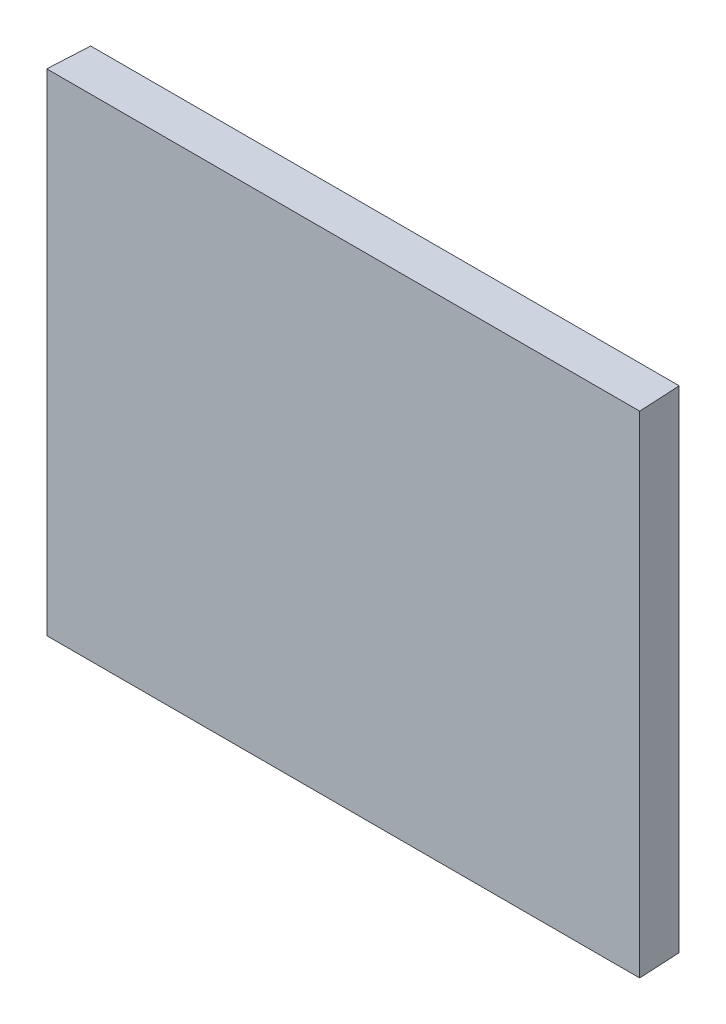
ISO-10303-21;
HEADER;
FILE_DESCRIPTION(('STEP AP214'),'2;1');
FILE_NAME('part.step','',(''),(''),'','','');
FILE_SCHEMA(('AUTOMOTIVE_DESIGN { 1 0 10303 214 1 1 1 1 }'));
ENDSEC;
DATA;
#1=APPLICATION_CONTEXT('core data for automotive mechanical design processes');
#2=APPLICATION_PROTOCOL_DEFINITION('international standard','automotive_design',2000,#1);
#3=PRODUCT_CONTEXT('',#1,'mechanical');
#4=PRODUCT('Part','Part','',(#3));
#5=PRODUCT_RELATED_PRODUCT_CATEGORY('part','',(#4));
#6=PRODUCT_DEFINITION_FORMATION('','',#4);
#7=PRODUCT_DEFINITION_CONTEXT('part definition',#1,'design');
#8=PRODUCT_DEFINITION('design','',#6,#7);
#9=PRODUCT_DEFINITION_SHAPE('','',#8);
#10=(LENGTH_UNIT() NAMED_UNIT(*) SI_UNIT(.MILLI.,.METRE.));
#11=(NAMED_UNIT(*) PLANE_ANGLE_UNIT() SI_UNIT($,.RADIAN.));
#12=(NAMED_UNIT(*) SI_UNIT($,.STERADIAN.) SOLID_ANGLE_UNIT());
#13=UNCERTAINTY_MEASURE_WITH_UNIT(LENGTH_MEASURE(1.E-05),#10,'distance_accuracy_value','');
#14=(GEOMETRIC_REPRESENTATION_CONTEXT(3) GLOBAL_UNCERTAINTY_ASSIGNED_CONTEXT((#13)) GLOBAL_UNIT_ASSIGNED_CONTEXT((#10,
#11,#12)) REPRESENTATION_CONTEXT('',''));
#15=CARTESIAN_POINT('',(0.,0.,0.));
#16=DIRECTION('',(0.,0.,1.));
#17=DIRECTION('',(1.,0.,0.));
#18=AXIS2_PLACEMENT_3D('',#15,#16,#17);
#19=CARTESIAN_POINT('',(46.30779611036,8.91,1.97));
#20=DIRECTION('',(0.,1.,0.));
#21=DIRECTION('',(1.,0.,0.));
#22=AXIS2_PLACEMENT_3D('',#19,#20,#21);
#23=PLANE('',#22);
#24=DIRECTION('',(0.0523359562984605,0.,-0.998629534751664));
#25=VECTOR('',#24,1.);
#26=CARTESIAN_POINT('',(43.89220388965,8.91000000001,1.97000000001));
#27=LINE('',#26,#25);
#28=CARTESIAN_POINT('',(43.89220388964,8.91,1.97));
#29=VERTEX_POINT('',#28);
#30=CARTESIAN_POINT('',(43.90111321212,8.91,1.8));
#31=VERTEX_POINT('',#30);
#32=EDGE_CURVE('E20',#29,#31,#27,.T.);
#33=ORIENTED_EDGE('',*,*,#32,.T.);
#34=DIRECTION('',(1.,0.,0.));
#35=VECTOR('',#34,1.);
#36=CARTESIAN_POINT('',(43.90111321213,8.91000000001,1.80000000001));
#37=LINE('',#36,#35);
#38=CARTESIAN_POINT('',(46.29888678788,8.91,1.8));
#39=VERTEX_POINT('',#38);
#40=EDGE_CURVE('E72',#31,#39,#37,.T.);
#41=ORIENTED_EDGE('',*,*,#40,.T.);
#42=DIRECTION('',(0.0523359562984206,0.,0.998629534751666));
#43=VECTOR('',#42,1.);
#44=CARTESIAN_POINT('',(46.29888678789,8.91000000001,1.80000000001));
#45=LINE('',#44,#43);
#46=CARTESIAN_POINT('',(46.30779611036,8.91,1.97));
#47=VERTEX_POINT('',#46);
#48=EDGE_CURVE('E98',#39,#47,#45,.T.);
#49=ORIENTED_EDGE('',*,*,#48,.T.);
#50=DIRECTION('',(1.,0.,0.));
#51=VECTOR('',#50,1.);
#52=CARTESIAN_POINT('',(43.89220388965,8.91000000001,1.97000000001));
#53=LINE('',#52,#51);
#54=EDGE_CURVE('E73',#29,#47,#53,.T.);
#55=ORIENTED_EDGE('',*,*,#54,.F.);
#56=EDGE_LOOP('',(#33,#41,#49,#55));
#57=FACE_BOUND('',#56,.T.);
#58=ADVANCED_FACE('F17',(#57),#23,.F.);
#59=CARTESIAN_POINT('',(46.30779611036,10.91,1.97));
#60=DIRECTION('',(0.,1.,0.));
#61=DIRECTION('',(1.,0.,0.));
#62=AXIS2_PLACEMENT_3D('',#59,#60,#61);
#63=PLANE('',#62);
#64=DIRECTION('',(-1.,0.,0.));
#65=VECTOR('',#64,1.);
#66=CARTESIAN_POINT('',(46.30779611037,10.91000000001,1.97000000001));
#67=LINE('',#66,#65);
#68=CARTESIAN_POINT('',(46.30779611036,10.91,1.97));
#69=VERTEX_POINT('',#68);
#70=CARTESIAN_POINT('',(43.89220388964,10.91,1.97));
#71=VERTEX_POINT('',#70);
#72=EDGE_CURVE('E110',#69,#71,#67,.T.);
#73=ORIENTED_EDGE('',*,*,#72,.F.);
#74=DIRECTION('',(-0.0523359562983807,0.,-0.998629534751669));
#75=VECTOR('',#74,1.);
#76=CARTESIAN_POINT('',(46.30779611037,10.91000000001,1.97000000001));
#77=LINE('',#76,#75);
#78=CARTESIAN_POINT('',(46.29888678788,10.91,1.8));
#79=VERTEX_POINT('',#78);
#80=EDGE_CURVE('E101',#69,#79,#77,.T.);
#81=ORIENTED_EDGE('',*,*,#80,.T.);
#82=DIRECTION('',(1.,0.,0.));
#83=VECTOR('',#82,1.);
#84=CARTESIAN_POINT('',(43.90111321213,10.91000000001,1.80000000001));
#85=LINE('',#84,#83);
#86=CARTESIAN_POINT('',(43.90111321212,10.91,1.8));
#87=VERTEX_POINT('',#86);
#88=EDGE_CURVE('E82',#87,#79,#85,.T.);
#89=ORIENTED_EDGE('',*,*,#88,.F.);
#90=DIRECTION('',(-0.0523359562983807,0.,0.998629534751669));
#91=VECTOR('',#90,1.);
#92=CARTESIAN_POINT('',(43.90111321213,10.91000000001,1.80000000001));
#93=LINE('',#92,#91);
#94=EDGE_CURVE('E11',#87,#71,#93,.T.);
#95=ORIENTED_EDGE('',*,*,#94,.T.);
#96=EDGE_LOOP('',(#73,#81,#89,#95));
#97=FACE_BOUND('',#96,.T.);
#98=ADVANCED_FACE('F120',(#97),#63,.T.);
#99=CARTESIAN_POINT('',(43.89220388964,8.91,1.97));
#100=DIRECTION('',(0.998629534754574,0.,0.0523359562429486));
#101=DIRECTION('',(0.,-1.,0.));
#102=AXIS2_PLACEMENT_3D('',#99,#100,#101);
#103=PLANE('',#102);
#104=ORIENTED_EDGE('',*,*,#32,.F.);
#105=DIRECTION('',(0.,-1.,0.));
#106=VECTOR('',#105,1.);
#107=CARTESIAN_POINT('',(43.89220388965,10.91000000001,1.97000000001));
#108=LINE('',#107,#106);
#109=EDGE_CURVE('E75',#71,#29,#108,.T.);
#110=ORIENTED_EDGE('',*,*,#109,.F.);
#111=ORIENTED_EDGE('',*,*,#94,.F.);
#112=DIRECTION('',(0.,-1.,0.));
#113=VECTOR('',#112,1.);
#114=CARTESIAN_POINT('',(43.90111321213,10.91000000001,1.80000000001));
#115=LINE('',#114,#113);
#116=EDGE_CURVE('E77',#87,#31,#115,.T.);
#117=ORIENTED_EDGE('',*,*,#116,.T.);
#118=EDGE_LOOP('',(#104,#110,#111,#117));
#119=FACE_BOUND('',#118,.T.);
#120=ADVANCED_FACE('F78',(#119),#103,.F.);
#121=CARTESIAN_POINT('',(46.30779611036,8.91,1.97));
#122=DIRECTION('',(0.,0.,-1.));
#123=DIRECTION('',(0.,-1.,0.));
#124=AXIS2_PLACEMENT_3D('',#121,#122,#123);
#125=PLANE('',#124);
#126=ORIENTED_EDGE('',*,*,#54,.T.);
#127=DIRECTION('',(0.,1.,0.));
#128=VECTOR('',#127,1.);
#129=CARTESIAN_POINT('',(46.30779611037,8.91000000001,1.97000000001));
#130=LINE('',#129,#128);
#131=EDGE_CURVE('E102',#47,#69,#130,.T.);
#132=ORIENTED_EDGE('',*,*,#131,.T.);
#133=ORIENTED_EDGE('',*,*,#72,.T.);
#134=ORIENTED_EDGE('',*,*,#109,.T.);
#135=EDGE_LOOP('',(#126,#132,#133,#134));
#136=FACE_BOUND('',#135,.T.);
#137=ADVANCED_FACE('F117',(#136),#125,.F.);
#138=CARTESIAN_POINT('',(46.30779611036,8.91,1.97));
#139=DIRECTION('',(-0.998629534754574,0.,0.0523359562429486));
#140=DIRECTION('',(0.,1.,0.));
#141=AXIS2_PLACEMENT_3D('',#138,#139,#140);
#142=PLANE('',#141);
#143=ORIENTED_EDGE('',*,*,#48,.F.);
#144=DIRECTION('',(0.,1.,0.));
#145=VECTOR('',#144,1.);
#146=CARTESIAN_POINT('',(46.29888678789,8.91000000001,1.80000000001));
#147=LINE('',#146,#145);
#148=EDGE_CURVE('E87',#39,#79,#147,.T.);
#149=ORIENTED_EDGE('',*,*,#148,.T.);
#150=ORIENTED_EDGE('',*,*,#80,.F.);
#151=ORIENTED_EDGE('',*,*,#131,.F.);
#152=EDGE_LOOP('',(#143,#149,#150,#151));
#153=FACE_BOUND('',#152,.T.);
#154=ADVANCED_FACE('F122',(#153),#142,.F.);
#155=CARTESIAN_POINT('',(46.29888678788,8.91,1.8));
#156=DIRECTION('',(0.,0.,1.));
#157=DIRECTION('',(1.,0.,0.));
#158=AXIS2_PLACEMENT_3D('',#155,#156,#157);
#159=PLANE('',#158);
#160=ORIENTED_EDGE('',*,*,#40,.F.);
#161=ORIENTED_EDGE('',*,*,#116,.F.);
#162=ORIENTED_EDGE('',*,*,#88,.T.);
#163=ORIENTED_EDGE('',*,*,#148,.F.);
#164=EDGE_LOOP('',(#160,#161,#162,#163));
#165=FACE_BOUND('',#164,.T.);
#166=ADVANCED_FACE('F85',(#165),#159,.F.);
#167=CLOSED_SHELL('',(#58,#98,#120,#137,#154,#166));
#168=MANIFOLD_SOLID_BREP('B1',#167);
#169=ADVANCED_BREP_SHAPE_REPRESENTATION('',(#18,#168),#14);
#170=SHAPE_DEFINITION_REPRESENTATION(#9,#169);
ENDSEC;
END-ISO-10303-21;
